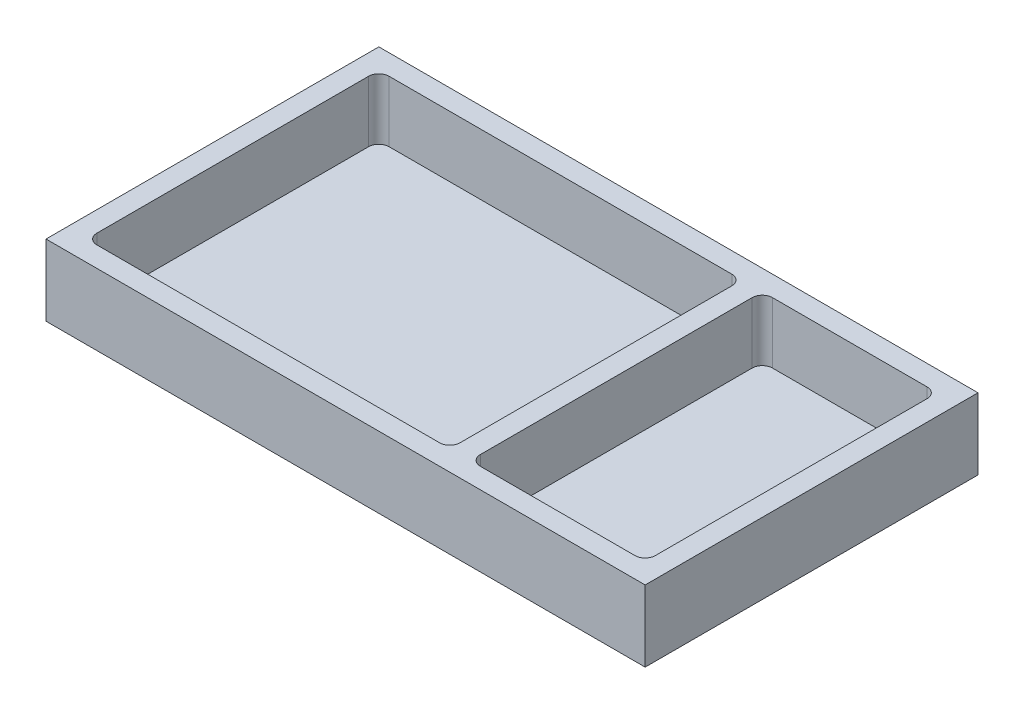
ISO-10303-21;
HEADER;
FILE_DESCRIPTION(('STEP AP214'),'2;1');
FILE_NAME('part.step','',(''),(''),'','','');
FILE_SCHEMA(('AUTOMOTIVE_DESIGN { 1 0 10303 214 1 1 1 1 }'));
ENDSEC;
DATA;
#1=APPLICATION_CONTEXT('core data for automotive mechanical design processes');
#2=APPLICATION_PROTOCOL_DEFINITION('international standard','automotive_design',2000,#1);
#3=PRODUCT_CONTEXT('',#1,'mechanical');
#4=PRODUCT('Part','Part','',(#3));
#5=PRODUCT_RELATED_PRODUCT_CATEGORY('part','',(#4));
#6=PRODUCT_DEFINITION_FORMATION('','',#4);
#7=PRODUCT_DEFINITION_CONTEXT('part definition',#1,'design');
#8=PRODUCT_DEFINITION('design','',#6,#7);
#9=PRODUCT_DEFINITION_SHAPE('','',#8);
#10=(LENGTH_UNIT() NAMED_UNIT(*) SI_UNIT(.MILLI.,.METRE.));
#11=(NAMED_UNIT(*) PLANE_ANGLE_UNIT() SI_UNIT($,.RADIAN.));
#12=(NAMED_UNIT(*) SI_UNIT($,.STERADIAN.) SOLID_ANGLE_UNIT());
#13=UNCERTAINTY_MEASURE_WITH_UNIT(LENGTH_MEASURE(1.E-05),#10,'distance_accuracy_value','');
#14=(GEOMETRIC_REPRESENTATION_CONTEXT(3) GLOBAL_UNCERTAINTY_ASSIGNED_CONTEXT((#13)) GLOBAL_UNIT_ASSIGNED_CONTEXT((#10,
#11,#12)) REPRESENTATION_CONTEXT('',''));
#15=CARTESIAN_POINT('',(0.,0.,0.));
#16=DIRECTION('',(0.,0.,1.));
#17=DIRECTION('',(1.,0.,0.));
#18=AXIS2_PLACEMENT_3D('',#15,#16,#17);
#19=CARTESIAN_POINT('',(0.,19.05,-103.910500649562));
#20=DIRECTION('',(0.,-1.,0.));
#21=DIRECTION('',(0.,0.,-1.));
#22=AXIS2_PLACEMENT_3D('',#19,#20,#21);
#23=PLANE('',#22);
#24=CARTESIAN_POINT('',(116.541319733707,19.05,-94.3855006495616));
#25=DIRECTION('',(0.,1.,0.));
#26=DIRECTION('',(0.,0.,1.));
#27=AXIS2_PLACEMENT_3D('',#24,#25,#26);
#28=CIRCLE('',#27,3.175);
#29=CARTESIAN_POINT('',(119.716319733707,19.05,-94.3855006495616));
#30=VERTEX_POINT('',#29);
#31=CARTESIAN_POINT('',(116.541319733707,19.05,-97.5605006495616));
#32=VERTEX_POINT('',#31);
#33=EDGE_CURVE('E250',#30,#32,#28,.T.);
#34=ORIENTED_EDGE('',*,*,#33,.F.);
#35=DIRECTION('',(0.,0.,-1.));
#36=VECTOR('',#35,1.);
#37=CARTESIAN_POINT('',(119.716319733707,19.05,-94.3855006495616));
#38=LINE('',#37,#36);
#39=CARTESIAN_POINT('',(119.716319733707,19.05,-9.52500000000002));
#40=VERTEX_POINT('',#39);
#41=EDGE_CURVE('E265',#40,#30,#38,.T.);
#42=ORIENTED_EDGE('',*,*,#41,.F.);
#43=CARTESIAN_POINT('',(116.541319733707,19.05,-9.525));
#44=DIRECTION('',(0.,1.,0.));
#45=DIRECTION('',(0.,0.,-1.));
#46=AXIS2_PLACEMENT_3D('',#43,#44,#45);
#47=CIRCLE('',#46,3.175);
#48=CARTESIAN_POINT('',(116.541319733707,19.05,-6.35));
#49=VERTEX_POINT('',#48);
#50=EDGE_CURVE('E263',#49,#40,#47,.T.);
#51=ORIENTED_EDGE('',*,*,#50,.F.);
#52=DIRECTION('',(1.,0.,0.));
#53=VECTOR('',#52,1.);
#54=CARTESIAN_POINT('',(9.52500000000002,19.05,-6.35));
#55=LINE('',#54,#53);
#56=CARTESIAN_POINT('',(9.52500000000002,19.05,-6.35));
#57=VERTEX_POINT('',#56);
#58=EDGE_CURVE('E261',#57,#49,#55,.T.);
#59=ORIENTED_EDGE('',*,*,#58,.F.);
#60=CARTESIAN_POINT('',(9.525,19.05,-9.525));
#61=DIRECTION('',(0.,1.,0.));
#62=DIRECTION('',(0.,0.,-1.));
#63=AXIS2_PLACEMENT_3D('',#60,#61,#62);
#64=CIRCLE('',#63,3.175);
#65=CARTESIAN_POINT('',(6.35,19.05,-9.52500000000002));
#66=VERTEX_POINT('',#65);
#67=EDGE_CURVE('E259',#66,#57,#64,.T.);
#68=ORIENTED_EDGE('',*,*,#67,.F.);
#69=DIRECTION('',(0.,0.,1.));
#70=VECTOR('',#69,1.);
#71=CARTESIAN_POINT('',(6.35,19.05,-9.52500000000002));
#72=LINE('',#71,#70);
#73=CARTESIAN_POINT('',(6.35,19.05,-94.3855006495616));
#74=VERTEX_POINT('',#73);
#75=EDGE_CURVE('E257',#74,#66,#72,.T.);
#76=ORIENTED_EDGE('',*,*,#75,.F.);
#77=CARTESIAN_POINT('',(9.525,19.05,-94.3855006495616));
#78=DIRECTION('',(0.,1.,0.));
#79=DIRECTION('',(0.,0.,-1.));
#80=AXIS2_PLACEMENT_3D('',#77,#78,#79);
#81=CIRCLE('',#80,3.175);
#82=CARTESIAN_POINT('',(9.52500000000003,19.05,-97.5605006495616));
#83=VERTEX_POINT('',#82);
#84=EDGE_CURVE('E255',#83,#74,#81,.T.);
#85=ORIENTED_EDGE('',*,*,#84,.F.);
#86=DIRECTION('',(-1.,0.,0.));
#87=VECTOR('',#86,1.);
#88=CARTESIAN_POINT('',(9.52500000000002,19.05,-97.5605006495616));
#89=LINE('',#88,#87);
#90=EDGE_CURVE('E252',#32,#83,#89,.T.);
#91=ORIENTED_EDGE('',*,*,#90,.F.);
#92=EDGE_LOOP('',(#34,#42,#51,#59,#68,#76,#85,#91));
#93=FACE_BOUND('',#92,.T.);
#94=DIRECTION('',(0.,0.,1.));
#95=VECTOR('',#94,1.);
#96=CARTESIAN_POINT('',(0.,19.05,0.));
#97=LINE('',#96,#95);
#98=CARTESIAN_POINT('',(0.,19.05,-103.910500649562));
#99=VERTEX_POINT('',#98);
#100=CARTESIAN_POINT('',(0.,19.05,0.));
#101=VERTEX_POINT('',#100);
#102=EDGE_CURVE('E305',#99,#101,#97,.T.);
#103=ORIENTED_EDGE('',*,*,#102,.T.);
#104=DIRECTION('',(1.,0.,0.));
#105=VECTOR('',#104,1.);
#106=CARTESIAN_POINT('',(0.,19.05,0.));
#107=LINE('',#106,#105);
#108=CARTESIAN_POINT('',(187.051787580175,19.05,0.));
#109=VERTEX_POINT('',#108);
#110=EDGE_CURVE('E171',#101,#109,#107,.T.);
#111=ORIENTED_EDGE('',*,*,#110,.T.);
#112=DIRECTION('',(0.,0.,-1.));
#113=VECTOR('',#112,1.);
#114=CARTESIAN_POINT('',(187.051787580175,19.05,0.));
#115=LINE('',#114,#113);
#116=CARTESIAN_POINT('',(187.051787580175,19.05,-103.910500649562));
#117=VERTEX_POINT('',#116);
#118=EDGE_CURVE('E308',#109,#117,#115,.T.);
#119=ORIENTED_EDGE('',*,*,#118,.T.);
#120=DIRECTION('',(-1.,0.,0.));
#121=VECTOR('',#120,1.);
#122=CARTESIAN_POINT('',(0.,19.05,-103.910500649562));
#123=LINE('',#122,#121);
#124=EDGE_CURVE('E310',#117,#99,#123,.T.);
#125=ORIENTED_EDGE('',*,*,#124,.T.);
#126=EDGE_LOOP('',(#103,#111,#119,#125));
#127=FACE_BOUND('',#126,.T.);
#128=CARTESIAN_POINT('',(129.241319733707,19.05,-94.3855006495616));
#129=DIRECTION('',(0.,1.,0.));
#130=DIRECTION('',(0.,0.,1.));
#131=AXIS2_PLACEMENT_3D('',#128,#129,#130);
#132=CIRCLE('',#131,3.175);
#133=CARTESIAN_POINT('',(129.241319733707,19.05,-97.5605006495616));
#134=VERTEX_POINT('',#133);
#135=CARTESIAN_POINT('',(126.066319733707,19.05,-94.3855006495616));
#136=VERTEX_POINT('',#135);
#137=EDGE_CURVE('E194',#134,#136,#132,.T.);
#138=ORIENTED_EDGE('',*,*,#137,.F.);
#139=DIRECTION('',(-1.,0.,0.));
#140=VECTOR('',#139,1.);
#141=CARTESIAN_POINT('',(129.241319733707,19.05,-97.5605006495616));
#142=LINE('',#141,#140);
#143=CARTESIAN_POINT('',(177.526787580175,19.05,-97.5605006495616));
#144=VERTEX_POINT('',#143);
#145=EDGE_CURVE('E209',#144,#134,#142,.T.);
#146=ORIENTED_EDGE('',*,*,#145,.F.);
#147=CARTESIAN_POINT('',(177.526787580175,19.05,-94.3855006495616));
#148=DIRECTION('',(0.,1.,0.));
#149=DIRECTION('',(0.,0.,1.));
#150=AXIS2_PLACEMENT_3D('',#147,#148,#149);
#151=CIRCLE('',#150,3.175);
#152=CARTESIAN_POINT('',(180.701787580175,19.05,-94.3855006495616));
#153=VERTEX_POINT('',#152);
#154=EDGE_CURVE('E207',#153,#144,#151,.T.);
#155=ORIENTED_EDGE('',*,*,#154,.F.);
#156=DIRECTION('',(0.,0.,-1.));
#157=VECTOR('',#156,1.);
#158=CARTESIAN_POINT('',(180.701787580175,19.05,-9.52500000000002));
#159=LINE('',#158,#157);
#160=CARTESIAN_POINT('',(180.701787580175,19.05,-9.52500000000002));
#161=VERTEX_POINT('',#160);
#162=EDGE_CURVE('E205',#161,#153,#159,.T.);
#163=ORIENTED_EDGE('',*,*,#162,.F.);
#164=CARTESIAN_POINT('',(177.526787580175,19.05,-9.525));
#165=DIRECTION('',(0.,1.,0.));
#166=DIRECTION('',(0.,0.,-1.));
#167=AXIS2_PLACEMENT_3D('',#164,#165,#166);
#168=CIRCLE('',#167,3.17500000000001);
#169=CARTESIAN_POINT('',(177.526787580175,19.05,-6.34999999999999));
#170=VERTEX_POINT('',#169);
#171=EDGE_CURVE('E203',#170,#161,#168,.T.);
#172=ORIENTED_EDGE('',*,*,#171,.F.);
#173=DIRECTION('',(1.,0.,0.));
#174=VECTOR('',#173,1.);
#175=CARTESIAN_POINT('',(129.241319733707,19.05,-6.34999999999999));
#176=LINE('',#175,#174);
#177=CARTESIAN_POINT('',(129.241319733707,19.05,-6.34999999999999));
#178=VERTEX_POINT('',#177);
#179=EDGE_CURVE('E201',#178,#170,#176,.T.);
#180=ORIENTED_EDGE('',*,*,#179,.F.);
#181=CARTESIAN_POINT('',(129.241319733707,19.05,-9.525));
#182=DIRECTION('',(0.,1.,0.));
#183=DIRECTION('',(0.,0.,1.));
#184=AXIS2_PLACEMENT_3D('',#181,#182,#183);
#185=CIRCLE('',#184,3.17500000000001);
#186=CARTESIAN_POINT('',(126.066319733707,19.05,-9.52500000000002));
#187=VERTEX_POINT('',#186);
#188=EDGE_CURVE('E199',#187,#178,#185,.T.);
#189=ORIENTED_EDGE('',*,*,#188,.F.);
#190=DIRECTION('',(0.,0.,1.));
#191=VECTOR('',#190,1.);
#192=CARTESIAN_POINT('',(126.066319733707,19.05,-94.3855006495616));
#193=LINE('',#192,#191);
#194=EDGE_CURVE('E196',#136,#187,#193,.T.);
#195=ORIENTED_EDGE('',*,*,#194,.F.);
#196=EDGE_LOOP('',(#138,#146,#155,#163,#172,#180,#189,#195));
#197=FACE_BOUND('',#196,.T.);
#198=ADVANCED_FACE('F31',(#93,#127,#197),#23,.F.);
#199=CARTESIAN_POINT('',(0.,19.05,0.));
#200=DIRECTION('',(1.,0.,0.));
#201=DIRECTION('',(0.,0.,-1.));
#202=AXIS2_PLACEMENT_3D('',#199,#200,#201);
#203=PLANE('',#202);
#204=DIRECTION('',(0.,-1.,0.));
#205=VECTOR('',#204,1.);
#206=CARTESIAN_POINT('',(0.,19.05,-103.910500649562));
#207=LINE('',#206,#205);
#208=CARTESIAN_POINT('',(0.,-3.175,-103.910500649562));
#209=VERTEX_POINT('',#208);
#210=EDGE_CURVE('E187',#99,#209,#207,.T.);
#211=ORIENTED_EDGE('',*,*,#210,.T.);
#212=DIRECTION('',(0.,0.,1.));
#213=VECTOR('',#212,1.);
#214=CARTESIAN_POINT('',(0.,-3.175,-103.910500649562));
#215=LINE('',#214,#213);
#216=CARTESIAN_POINT('',(0.,-3.175,0.));
#217=VERTEX_POINT('',#216);
#218=EDGE_CURVE('E181',#209,#217,#215,.T.);
#219=ORIENTED_EDGE('',*,*,#218,.T.);
#220=DIRECTION('',(0.,-1.,0.));
#221=VECTOR('',#220,1.);
#222=CARTESIAN_POINT('',(0.,19.05,0.));
#223=LINE('',#222,#221);
#224=EDGE_CURVE('E11',#101,#217,#223,.T.);
#225=ORIENTED_EDGE('',*,*,#224,.F.);
#226=ORIENTED_EDGE('',*,*,#102,.F.);
#227=EDGE_LOOP('',(#211,#219,#225,#226));
#228=FACE_BOUND('',#227,.T.);
#229=ADVANCED_FACE('F33',(#228),#203,.F.);
#230=CARTESIAN_POINT('',(0.,19.05,0.));
#231=DIRECTION('',(0.,0.,-1.));
#232=DIRECTION('',(-1.,0.,0.));
#233=AXIS2_PLACEMENT_3D('',#230,#231,#232);
#234=PLANE('',#233);
#235=ORIENTED_EDGE('',*,*,#224,.T.);
#236=DIRECTION('',(1.,0.,0.));
#237=VECTOR('',#236,1.);
#238=CARTESIAN_POINT('',(0.,-3.175,0.));
#239=LINE('',#238,#237);
#240=CARTESIAN_POINT('',(187.051787580175,-3.175,0.));
#241=VERTEX_POINT('',#240);
#242=EDGE_CURVE('E170',#217,#241,#239,.T.);
#243=ORIENTED_EDGE('',*,*,#242,.T.);
#244=DIRECTION('',(0.,-1.,0.));
#245=VECTOR('',#244,1.);
#246=CARTESIAN_POINT('',(187.051787580175,19.05,0.));
#247=LINE('',#246,#245);
#248=EDGE_CURVE('E39',#109,#241,#247,.T.);
#249=ORIENTED_EDGE('',*,*,#248,.F.);
#250=ORIENTED_EDGE('',*,*,#110,.F.);
#251=EDGE_LOOP('',(#235,#243,#249,#250));
#252=FACE_BOUND('',#251,.T.);
#253=ADVANCED_FACE('F168',(#252),#234,.F.);
#254=CARTESIAN_POINT('',(187.051787580175,19.05,0.));
#255=DIRECTION('',(-1.,0.,0.));
#256=DIRECTION('',(0.,0.,1.));
#257=AXIS2_PLACEMENT_3D('',#254,#255,#256);
#258=PLANE('',#257);
#259=ORIENTED_EDGE('',*,*,#248,.T.);
#260=DIRECTION('',(0.,0.,-1.));
#261=VECTOR('',#260,1.);
#262=CARTESIAN_POINT('',(187.051787580175,-3.175,-103.910500649562));
#263=LINE('',#262,#261);
#264=CARTESIAN_POINT('',(187.051787580175,-3.175,-103.910500649562));
#265=VERTEX_POINT('',#264);
#266=EDGE_CURVE('E184',#241,#265,#263,.T.);
#267=ORIENTED_EDGE('',*,*,#266,.T.);
#268=DIRECTION('',(0.,-1.,0.));
#269=VECTOR('',#268,1.);
#270=CARTESIAN_POINT('',(187.051787580175,19.05,-103.910500649562));
#271=LINE('',#270,#269);
#272=EDGE_CURVE('E313',#117,#265,#271,.T.);
#273=ORIENTED_EDGE('',*,*,#272,.F.);
#274=ORIENTED_EDGE('',*,*,#118,.F.);
#275=EDGE_LOOP('',(#259,#267,#273,#274));
#276=FACE_BOUND('',#275,.T.);
#277=ADVANCED_FACE('F316',(#276),#258,.F.);
#278=CARTESIAN_POINT('',(0.,19.05,-103.910500649562));
#279=DIRECTION('',(0.,0.,1.));
#280=DIRECTION('',(1.,0.,0.));
#281=AXIS2_PLACEMENT_3D('',#278,#279,#280);
#282=PLANE('',#281);
#283=ORIENTED_EDGE('',*,*,#272,.T.);
#284=DIRECTION('',(-1.,0.,0.));
#285=VECTOR('',#284,1.);
#286=CARTESIAN_POINT('',(0.,-3.175,-103.910500649562));
#287=LINE('',#286,#285);
#288=EDGE_CURVE('E191',#265,#209,#287,.T.);
#289=ORIENTED_EDGE('',*,*,#288,.T.);
#290=ORIENTED_EDGE('',*,*,#210,.F.);
#291=ORIENTED_EDGE('',*,*,#124,.F.);
#292=EDGE_LOOP('',(#283,#289,#290,#291));
#293=FACE_BOUND('',#292,.T.);
#294=ADVANCED_FACE('F322',(#293),#282,.F.);
#295=CARTESIAN_POINT('',(116.541319733707,19.05,-94.3855006495616));
#296=DIRECTION('',(0.,-1.,0.));
#297=DIRECTION('',(0.,0.,-1.));
#298=AXIS2_PLACEMENT_3D('',#295,#296,#297);
#299=CYLINDRICAL_SURFACE('',#298,3.175);
#300=CARTESIAN_POINT('',(116.541319733707,0.,-94.3855006495616));
#301=DIRECTION('',(0.,1.,0.));
#302=DIRECTION('',(0.,0.,1.));
#303=AXIS2_PLACEMENT_3D('',#300,#301,#302);
#304=CIRCLE('',#303,3.175);
#305=CARTESIAN_POINT('',(119.716319733707,0.,-94.3855006495616));
#306=VERTEX_POINT('',#305);
#307=CARTESIAN_POINT('',(116.541319733707,0.,-97.5605006495616));
#308=VERTEX_POINT('',#307);
#309=EDGE_CURVE('E249',#306,#308,#304,.T.);
#310=ORIENTED_EDGE('',*,*,#309,.F.);
#311=DIRECTION('',(0.,-1.,0.));
#312=VECTOR('',#311,1.);
#313=CARTESIAN_POINT('',(119.716319733707,19.05,-94.3855006495616));
#314=LINE('',#313,#312);
#315=EDGE_CURVE('E267',#30,#306,#314,.T.);
#316=ORIENTED_EDGE('',*,*,#315,.F.);
#317=ORIENTED_EDGE('',*,*,#33,.T.);
#318=DIRECTION('',(0.,-1.,0.));
#319=VECTOR('',#318,1.);
#320=CARTESIAN_POINT('',(116.541319733707,19.05,-97.5605006495616));
#321=LINE('',#320,#319);
#322=EDGE_CURVE('E302',#32,#308,#321,.T.);
#323=ORIENTED_EDGE('',*,*,#322,.T.);
#324=EDGE_LOOP('',(#310,#316,#317,#323));
#325=FACE_BOUND('',#324,.T.);
#326=ADVANCED_FACE('F324',(#325),#299,.F.);
#327=CARTESIAN_POINT('',(9.52500000000002,19.05,-97.5605006495616));
#328=DIRECTION('',(0.,0.,1.));
#329=DIRECTION('',(1.,0.,0.));
#330=AXIS2_PLACEMENT_3D('',#327,#328,#329);
#331=PLANE('',#330);
#332=DIRECTION('',(-1.,0.,0.));
#333=VECTOR('',#332,1.);
#334=CARTESIAN_POINT('',(9.52500000000002,0.,-97.5605006495616));
#335=LINE('',#334,#333);
#336=CARTESIAN_POINT('',(9.52500000000003,0.,-97.5605006495616));
#337=VERTEX_POINT('',#336);
#338=EDGE_CURVE('E270',#308,#337,#335,.T.);
#339=ORIENTED_EDGE('',*,*,#338,.F.);
#340=ORIENTED_EDGE('',*,*,#322,.F.);
#341=ORIENTED_EDGE('',*,*,#90,.T.);
#342=DIRECTION('',(0.,-1.,0.));
#343=VECTOR('',#342,1.);
#344=CARTESIAN_POINT('',(9.52500000000003,19.05,-97.5605006495616));
#345=LINE('',#344,#343);
#346=EDGE_CURVE('E300',#83,#337,#345,.T.);
#347=ORIENTED_EDGE('',*,*,#346,.T.);
#348=EDGE_LOOP('',(#339,#340,#341,#347));
#349=FACE_BOUND('',#348,.T.);
#350=ADVANCED_FACE('F330',(#349),#331,.T.);
#351=CARTESIAN_POINT('',(9.525,19.05,-94.3855006495616));
#352=DIRECTION('',(0.,-1.,0.));
#353=DIRECTION('',(0.,0.,-1.));
#354=AXIS2_PLACEMENT_3D('',#351,#352,#353);
#355=CYLINDRICAL_SURFACE('',#354,3.175);
#356=CARTESIAN_POINT('',(9.525,0.,-94.3855006495616));
#357=DIRECTION('',(0.,1.,0.));
#358=DIRECTION('',(0.,0.,-1.));
#359=AXIS2_PLACEMENT_3D('',#356,#357,#358);
#360=CIRCLE('',#359,3.175);
#361=CARTESIAN_POINT('',(6.35,0.,-94.3855006495616));
#362=VERTEX_POINT('',#361);
#363=EDGE_CURVE('E273',#337,#362,#360,.T.);
#364=ORIENTED_EDGE('',*,*,#363,.F.);
#365=ORIENTED_EDGE('',*,*,#346,.F.);
#366=ORIENTED_EDGE('',*,*,#84,.T.);
#367=DIRECTION('',(0.,-1.,0.));
#368=VECTOR('',#367,1.);
#369=CARTESIAN_POINT('',(6.35,19.05,-94.3855006495616));
#370=LINE('',#369,#368);
#371=EDGE_CURVE('E298',#74,#362,#370,.T.);
#372=ORIENTED_EDGE('',*,*,#371,.T.);
#373=EDGE_LOOP('',(#364,#365,#366,#372));
#374=FACE_BOUND('',#373,.T.);
#375=ADVANCED_FACE('F344',(#374),#355,.F.);
#376=CARTESIAN_POINT('',(6.35,19.05,-9.52500000000002));
#377=DIRECTION('',(1.,0.,0.));
#378=DIRECTION('',(0.,0.,-1.));
#379=AXIS2_PLACEMENT_3D('',#376,#377,#378);
#380=PLANE('',#379);
#381=DIRECTION('',(0.,0.,1.));
#382=VECTOR('',#381,1.);
#383=CARTESIAN_POINT('',(6.35,0.,-9.52500000000002));
#384=LINE('',#383,#382);
#385=CARTESIAN_POINT('',(6.35,0.,-9.52500000000002));
#386=VERTEX_POINT('',#385);
#387=EDGE_CURVE('E276',#362,#386,#384,.T.);
#388=ORIENTED_EDGE('',*,*,#387,.F.);
#389=ORIENTED_EDGE('',*,*,#371,.F.);
#390=ORIENTED_EDGE('',*,*,#75,.T.);
#391=DIRECTION('',(0.,-1.,0.));
#392=VECTOR('',#391,1.);
#393=CARTESIAN_POINT('',(6.35,19.05,-9.52500000000002));
#394=LINE('',#393,#392);
#395=EDGE_CURVE('E296',#66,#386,#394,.T.);
#396=ORIENTED_EDGE('',*,*,#395,.T.);
#397=EDGE_LOOP('',(#388,#389,#390,#396));
#398=FACE_BOUND('',#397,.T.);
#399=ADVANCED_FACE('F348',(#398),#380,.T.);
#400=CARTESIAN_POINT('',(9.525,19.05,-9.525));
#401=DIRECTION('',(0.,-1.,0.));
#402=DIRECTION('',(0.,0.,-1.));
#403=AXIS2_PLACEMENT_3D('',#400,#401,#402);
#404=CYLINDRICAL_SURFACE('',#403,3.175);
#405=CARTESIAN_POINT('',(9.525,0.,-9.525));
#406=DIRECTION('',(0.,1.,0.));
#407=DIRECTION('',(0.,0.,-1.));
#408=AXIS2_PLACEMENT_3D('',#405,#406,#407);
#409=CIRCLE('',#408,3.175);
#410=CARTESIAN_POINT('',(9.52500000000002,0.,-6.35));
#411=VERTEX_POINT('',#410);
#412=EDGE_CURVE('E279',#386,#411,#409,.T.);
#413=ORIENTED_EDGE('',*,*,#412,.F.);
#414=ORIENTED_EDGE('',*,*,#395,.F.);
#415=ORIENTED_EDGE('',*,*,#67,.T.);
#416=DIRECTION('',(0.,-1.,0.));
#417=VECTOR('',#416,1.);
#418=CARTESIAN_POINT('',(9.52500000000002,19.05,-6.35));
#419=LINE('',#418,#417);
#420=EDGE_CURVE('E294',#57,#411,#419,.T.);
#421=ORIENTED_EDGE('',*,*,#420,.T.);
#422=EDGE_LOOP('',(#413,#414,#415,#421));
#423=FACE_BOUND('',#422,.T.);
#424=ADVANCED_FACE('F352',(#423),#404,.F.);
#425=CARTESIAN_POINT('',(9.52500000000002,19.05,-6.35));
#426=DIRECTION('',(0.,0.,-1.));
#427=DIRECTION('',(-1.,0.,0.));
#428=AXIS2_PLACEMENT_3D('',#425,#426,#427);
#429=PLANE('',#428);
#430=DIRECTION('',(1.,0.,0.));
#431=VECTOR('',#430,1.);
#432=CARTESIAN_POINT('',(9.52500000000002,0.,-6.35));
#433=LINE('',#432,#431);
#434=CARTESIAN_POINT('',(116.541319733707,0.,-6.35));
#435=VERTEX_POINT('',#434);
#436=EDGE_CURVE('E282',#411,#435,#433,.T.);
#437=ORIENTED_EDGE('',*,*,#436,.F.);
#438=ORIENTED_EDGE('',*,*,#420,.F.);
#439=ORIENTED_EDGE('',*,*,#58,.T.);
#440=DIRECTION('',(0.,-1.,0.));
#441=VECTOR('',#440,1.);
#442=CARTESIAN_POINT('',(116.541319733707,19.05,-6.35));
#443=LINE('',#442,#441);
#444=EDGE_CURVE('E292',#49,#435,#443,.T.);
#445=ORIENTED_EDGE('',*,*,#444,.T.);
#446=EDGE_LOOP('',(#437,#438,#439,#445));
#447=FACE_BOUND('',#446,.T.);
#448=ADVANCED_FACE('F356',(#447),#429,.T.);
#449=CARTESIAN_POINT('',(116.541319733707,19.05,-9.525));
#450=DIRECTION('',(0.,-1.,0.));
#451=DIRECTION('',(0.,0.,-1.));
#452=AXIS2_PLACEMENT_3D('',#449,#450,#451);
#453=CYLINDRICAL_SURFACE('',#452,3.175);
#454=CARTESIAN_POINT('',(116.541319733707,0.,-9.525));
#455=DIRECTION('',(0.,1.,0.));
#456=DIRECTION('',(0.,0.,-1.));
#457=AXIS2_PLACEMENT_3D('',#454,#455,#456);
#458=CIRCLE('',#457,3.175);
#459=CARTESIAN_POINT('',(119.716319733707,0.,-9.52500000000002));
#460=VERTEX_POINT('',#459);
#461=EDGE_CURVE('E285',#435,#460,#458,.T.);
#462=ORIENTED_EDGE('',*,*,#461,.F.);
#463=ORIENTED_EDGE('',*,*,#444,.F.);
#464=ORIENTED_EDGE('',*,*,#50,.T.);
#465=DIRECTION('',(0.,-1.,0.));
#466=VECTOR('',#465,1.);
#467=CARTESIAN_POINT('',(119.716319733707,19.05,-9.52500000000002));
#468=LINE('',#467,#466);
#469=EDGE_CURVE('E54',#40,#460,#468,.T.);
#470=ORIENTED_EDGE('',*,*,#469,.T.);
#471=EDGE_LOOP('',(#462,#463,#464,#470));
#472=FACE_BOUND('',#471,.T.);
#473=ADVANCED_FACE('F360',(#472),#453,.F.);
#474=CARTESIAN_POINT('',(119.716319733707,19.05,-94.3855006495616));
#475=DIRECTION('',(-1.,0.,0.));
#476=DIRECTION('',(0.,0.,1.));
#477=AXIS2_PLACEMENT_3D('',#474,#475,#476);
#478=PLANE('',#477);
#479=DIRECTION('',(0.,0.,-1.));
#480=VECTOR('',#479,1.);
#481=CARTESIAN_POINT('',(119.716319733707,0.,-94.3855006495616));
#482=LINE('',#481,#480);
#483=EDGE_CURVE('E253',#460,#306,#482,.T.);
#484=ORIENTED_EDGE('',*,*,#483,.F.);
#485=ORIENTED_EDGE('',*,*,#469,.F.);
#486=ORIENTED_EDGE('',*,*,#41,.T.);
#487=ORIENTED_EDGE('',*,*,#315,.T.);
#488=EDGE_LOOP('',(#484,#485,#486,#487));
#489=FACE_BOUND('',#488,.T.);
#490=ADVANCED_FACE('F364',(#489),#478,.T.);
#491=CARTESIAN_POINT('',(129.241319733707,19.05,-94.3855006495616));
#492=DIRECTION('',(0.,-1.,0.));
#493=DIRECTION('',(0.,0.,-1.));
#494=AXIS2_PLACEMENT_3D('',#491,#492,#493);
#495=CYLINDRICAL_SURFACE('',#494,3.175);
#496=CARTESIAN_POINT('',(129.241319733707,0.,-94.3855006495616));
#497=DIRECTION('',(0.,1.,0.));
#498=DIRECTION('',(0.,0.,1.));
#499=AXIS2_PLACEMENT_3D('',#496,#497,#498);
#500=CIRCLE('',#499,3.175);
#501=CARTESIAN_POINT('',(129.241319733707,0.,-97.5605006495616));
#502=VERTEX_POINT('',#501);
#503=CARTESIAN_POINT('',(126.066319733707,0.,-94.3855006495616));
#504=VERTEX_POINT('',#503);
#505=EDGE_CURVE('E193',#502,#504,#500,.T.);
#506=ORIENTED_EDGE('',*,*,#505,.F.);
#507=DIRECTION('',(0.,-1.,0.));
#508=VECTOR('',#507,1.);
#509=CARTESIAN_POINT('',(129.241319733707,19.05,-97.5605006495616));
#510=LINE('',#509,#508);
#511=EDGE_CURVE('E211',#134,#502,#510,.T.);
#512=ORIENTED_EDGE('',*,*,#511,.F.);
#513=ORIENTED_EDGE('',*,*,#137,.T.);
#514=DIRECTION('',(0.,-1.,0.));
#515=VECTOR('',#514,1.);
#516=CARTESIAN_POINT('',(126.066319733707,19.05,-94.3855006495616));
#517=LINE('',#516,#515);
#518=EDGE_CURVE('E246',#136,#504,#517,.T.);
#519=ORIENTED_EDGE('',*,*,#518,.T.);
#520=EDGE_LOOP('',(#506,#512,#513,#519));
#521=FACE_BOUND('',#520,.T.);
#522=ADVANCED_FACE('F368',(#521),#495,.F.);
#523=CARTESIAN_POINT('',(126.066319733707,19.05,-94.3855006495616));
#524=DIRECTION('',(1.,0.,0.));
#525=DIRECTION('',(0.,0.,-1.));
#526=AXIS2_PLACEMENT_3D('',#523,#524,#525);
#527=PLANE('',#526);
#528=DIRECTION('',(0.,0.,1.));
#529=VECTOR('',#528,1.);
#530=CARTESIAN_POINT('',(126.066319733707,0.,-94.3855006495616));
#531=LINE('',#530,#529);
#532=CARTESIAN_POINT('',(126.066319733707,0.,-9.52500000000002));
#533=VERTEX_POINT('',#532);
#534=EDGE_CURVE('E214',#504,#533,#531,.T.);
#535=ORIENTED_EDGE('',*,*,#534,.F.);
#536=ORIENTED_EDGE('',*,*,#518,.F.);
#537=ORIENTED_EDGE('',*,*,#194,.T.);
#538=DIRECTION('',(0.,-1.,0.));
#539=VECTOR('',#538,1.);
#540=CARTESIAN_POINT('',(126.066319733707,19.05,-9.52500000000002));
#541=LINE('',#540,#539);
#542=EDGE_CURVE('E244',#187,#533,#541,.T.);
#543=ORIENTED_EDGE('',*,*,#542,.T.);
#544=EDGE_LOOP('',(#535,#536,#537,#543));
#545=FACE_BOUND('',#544,.T.);
#546=ADVANCED_FACE('F371',(#545),#527,.T.);
#547=CARTESIAN_POINT('',(129.241319733707,19.05,-9.525));
#548=DIRECTION('',(0.,-1.,0.));
#549=DIRECTION('',(0.,0.,-1.));
#550=AXIS2_PLACEMENT_3D('',#547,#548,#549);
#551=CYLINDRICAL_SURFACE('',#550,3.17500000000001);
#552=CARTESIAN_POINT('',(129.241319733707,0.,-9.525));
#553=DIRECTION('',(0.,1.,0.));
#554=DIRECTION('',(0.,0.,1.));
#555=AXIS2_PLACEMENT_3D('',#552,#553,#554);
#556=CIRCLE('',#555,3.17500000000001);
#557=CARTESIAN_POINT('',(129.241319733707,0.,-6.34999999999999));
#558=VERTEX_POINT('',#557);
#559=EDGE_CURVE('E217',#533,#558,#556,.T.);
#560=ORIENTED_EDGE('',*,*,#559,.F.);
#561=ORIENTED_EDGE('',*,*,#542,.F.);
#562=ORIENTED_EDGE('',*,*,#188,.T.);
#563=DIRECTION('',(0.,-1.,0.));
#564=VECTOR('',#563,1.);
#565=CARTESIAN_POINT('',(129.241319733707,19.05,-6.34999999999999));
#566=LINE('',#565,#564);
#567=EDGE_CURVE('E242',#178,#558,#566,.T.);
#568=ORIENTED_EDGE('',*,*,#567,.T.);
#569=EDGE_LOOP('',(#560,#561,#562,#568));
#570=FACE_BOUND('',#569,.T.);
#571=ADVANCED_FACE('F375',(#570),#551,.F.);
#572=CARTESIAN_POINT('',(129.241319733707,19.05,-6.34999999999999));
#573=DIRECTION('',(0.,0.,-1.));
#574=DIRECTION('',(-1.,0.,0.));
#575=AXIS2_PLACEMENT_3D('',#572,#573,#574);
#576=PLANE('',#575);
#577=DIRECTION('',(1.,0.,0.));
#578=VECTOR('',#577,1.);
#579=CARTESIAN_POINT('',(129.241319733707,0.,-6.34999999999999));
#580=LINE('',#579,#578);
#581=CARTESIAN_POINT('',(177.526787580175,0.,-6.34999999999999));
#582=VERTEX_POINT('',#581);
#583=EDGE_CURVE('E220',#558,#582,#580,.T.);
#584=ORIENTED_EDGE('',*,*,#583,.F.);
#585=ORIENTED_EDGE('',*,*,#567,.F.);
#586=ORIENTED_EDGE('',*,*,#179,.T.);
#587=DIRECTION('',(0.,-1.,0.));
#588=VECTOR('',#587,1.);
#589=CARTESIAN_POINT('',(177.526787580175,19.05,-6.34999999999999));
#590=LINE('',#589,#588);
#591=EDGE_CURVE('E240',#170,#582,#590,.T.);
#592=ORIENTED_EDGE('',*,*,#591,.T.);
#593=EDGE_LOOP('',(#584,#585,#586,#592));
#594=FACE_BOUND('',#593,.T.);
#595=ADVANCED_FACE('F379',(#594),#576,.T.);
#596=CARTESIAN_POINT('',(177.526787580175,19.05,-9.525));
#597=DIRECTION('',(0.,-1.,0.));
#598=DIRECTION('',(0.,0.,-1.));
#599=AXIS2_PLACEMENT_3D('',#596,#597,#598);
#600=CYLINDRICAL_SURFACE('',#599,3.17500000000001);
#601=CARTESIAN_POINT('',(177.526787580175,0.,-9.525));
#602=DIRECTION('',(0.,1.,0.));
#603=DIRECTION('',(0.,0.,-1.));
#604=AXIS2_PLACEMENT_3D('',#601,#602,#603);
#605=CIRCLE('',#604,3.17500000000001);
#606=CARTESIAN_POINT('',(180.701787580175,0.,-9.52500000000002));
#607=VERTEX_POINT('',#606);
#608=EDGE_CURVE('E223',#582,#607,#605,.T.);
#609=ORIENTED_EDGE('',*,*,#608,.F.);
#610=ORIENTED_EDGE('',*,*,#591,.F.);
#611=ORIENTED_EDGE('',*,*,#171,.T.);
#612=DIRECTION('',(0.,-1.,0.));
#613=VECTOR('',#612,1.);
#614=CARTESIAN_POINT('',(180.701787580175,19.05,-9.52500000000002));
#615=LINE('',#614,#613);
#616=EDGE_CURVE('E238',#161,#607,#615,.T.);
#617=ORIENTED_EDGE('',*,*,#616,.T.);
#618=EDGE_LOOP('',(#609,#610,#611,#617));
#619=FACE_BOUND('',#618,.T.);
#620=ADVANCED_FACE('F383',(#619),#600,.F.);
#621=CARTESIAN_POINT('',(180.701787580175,19.05,-9.52500000000002));
#622=DIRECTION('',(-1.,0.,0.));
#623=DIRECTION('',(0.,0.,1.));
#624=AXIS2_PLACEMENT_3D('',#621,#622,#623);
#625=PLANE('',#624);
#626=DIRECTION('',(0.,0.,-1.));
#627=VECTOR('',#626,1.);
#628=CARTESIAN_POINT('',(180.701787580175,0.,-9.52500000000002));
#629=LINE('',#628,#627);
#630=CARTESIAN_POINT('',(180.701787580175,0.,-94.3855006495616));
#631=VERTEX_POINT('',#630);
#632=EDGE_CURVE('E226',#607,#631,#629,.T.);
#633=ORIENTED_EDGE('',*,*,#632,.F.);
#634=ORIENTED_EDGE('',*,*,#616,.F.);
#635=ORIENTED_EDGE('',*,*,#162,.T.);
#636=DIRECTION('',(0.,-1.,0.));
#637=VECTOR('',#636,1.);
#638=CARTESIAN_POINT('',(180.701787580175,19.05,-94.3855006495616));
#639=LINE('',#638,#637);
#640=EDGE_CURVE('E236',#153,#631,#639,.T.);
#641=ORIENTED_EDGE('',*,*,#640,.T.);
#642=EDGE_LOOP('',(#633,#634,#635,#641));
#643=FACE_BOUND('',#642,.T.);
#644=ADVANCED_FACE('F387',(#643),#625,.T.);
#645=CARTESIAN_POINT('',(177.526787580175,19.05,-94.3855006495616));
#646=DIRECTION('',(0.,-1.,0.));
#647=DIRECTION('',(0.,0.,-1.));
#648=AXIS2_PLACEMENT_3D('',#645,#646,#647);
#649=CYLINDRICAL_SURFACE('',#648,3.175);
#650=CARTESIAN_POINT('',(177.526787580175,0.,-94.3855006495616));
#651=DIRECTION('',(0.,1.,0.));
#652=DIRECTION('',(0.,0.,1.));
#653=AXIS2_PLACEMENT_3D('',#650,#651,#652);
#654=CIRCLE('',#653,3.175);
#655=CARTESIAN_POINT('',(177.526787580175,0.,-97.5605006495616));
#656=VERTEX_POINT('',#655);
#657=EDGE_CURVE('E229',#631,#656,#654,.T.);
#658=ORIENTED_EDGE('',*,*,#657,.F.);
#659=ORIENTED_EDGE('',*,*,#640,.F.);
#660=ORIENTED_EDGE('',*,*,#154,.T.);
#661=DIRECTION('',(0.,-1.,0.));
#662=VECTOR('',#661,1.);
#663=CARTESIAN_POINT('',(177.526787580175,19.05,-97.5605006495616));
#664=LINE('',#663,#662);
#665=EDGE_CURVE('E46',#144,#656,#664,.T.);
#666=ORIENTED_EDGE('',*,*,#665,.T.);
#667=EDGE_LOOP('',(#658,#659,#660,#666));
#668=FACE_BOUND('',#667,.T.);
#669=ADVANCED_FACE('F391',(#668),#649,.F.);
#670=CARTESIAN_POINT('',(129.241319733707,19.05,-97.5605006495616));
#671=DIRECTION('',(0.,0.,1.));
#672=DIRECTION('',(1.,0.,0.));
#673=AXIS2_PLACEMENT_3D('',#670,#671,#672);
#674=PLANE('',#673);
#675=DIRECTION('',(-1.,0.,0.));
#676=VECTOR('',#675,1.);
#677=CARTESIAN_POINT('',(129.241319733707,0.,-97.5605006495616));
#678=LINE('',#677,#676);
#679=EDGE_CURVE('E197',#656,#502,#678,.T.);
#680=ORIENTED_EDGE('',*,*,#679,.F.);
#681=ORIENTED_EDGE('',*,*,#665,.F.);
#682=ORIENTED_EDGE('',*,*,#145,.T.);
#683=ORIENTED_EDGE('',*,*,#511,.T.);
#684=EDGE_LOOP('',(#680,#681,#682,#683));
#685=FACE_BOUND('',#684,.T.);
#686=ADVANCED_FACE('F395',(#685),#674,.T.);
#687=CARTESIAN_POINT('',(0.,0.,0.));
#688=DIRECTION('',(0.,1.,0.));
#689=DIRECTION('',(0.,0.,1.));
#690=AXIS2_PLACEMENT_3D('',#687,#688,#689);
#691=PLANE('',#690);
#692=ORIENTED_EDGE('',*,*,#679,.T.);
#693=ORIENTED_EDGE('',*,*,#505,.T.);
#694=ORIENTED_EDGE('',*,*,#534,.T.);
#695=ORIENTED_EDGE('',*,*,#559,.T.);
#696=ORIENTED_EDGE('',*,*,#583,.T.);
#697=ORIENTED_EDGE('',*,*,#608,.T.);
#698=ORIENTED_EDGE('',*,*,#632,.T.);
#699=ORIENTED_EDGE('',*,*,#657,.T.);
#700=EDGE_LOOP('',(#692,#693,#694,#695,#696,#697,#698,#699));
#701=FACE_BOUND('',#700,.T.);
#702=ADVANCED_FACE('F399',(#701),#691,.T.);
#703=ORIENTED_EDGE('',*,*,#483,.T.);
#704=ORIENTED_EDGE('',*,*,#309,.T.);
#705=ORIENTED_EDGE('',*,*,#338,.T.);
#706=ORIENTED_EDGE('',*,*,#363,.T.);
#707=ORIENTED_EDGE('',*,*,#387,.T.);
#708=ORIENTED_EDGE('',*,*,#412,.T.);
#709=ORIENTED_EDGE('',*,*,#436,.T.);
#710=ORIENTED_EDGE('',*,*,#461,.T.);
#711=EDGE_LOOP('',(#703,#704,#705,#706,#707,#708,#709,#710));
#712=FACE_BOUND('',#711,.T.);
#713=ADVANCED_FACE('F402',(#712),#691,.T.);
#714=CARTESIAN_POINT('',(0.,-3.175,0.));
#715=DIRECTION('',(0.,1.,0.));
#716=DIRECTION('',(0.,0.,1.));
#717=AXIS2_PLACEMENT_3D('',#714,#715,#716);
#718=PLANE('',#717);
#719=ORIENTED_EDGE('',*,*,#218,.F.);
#720=ORIENTED_EDGE('',*,*,#288,.F.);
#721=ORIENTED_EDGE('',*,*,#266,.F.);
#722=ORIENTED_EDGE('',*,*,#242,.F.);
#723=EDGE_LOOP('',(#719,#720,#721,#722));
#724=FACE_BOUND('',#723,.T.);
#725=ADVANCED_FACE('F179',(#724),#718,.F.);
#726=CLOSED_SHELL('',(#198,#229,#253,#277,#294,#326,#350,#375,#399,#424,#448,#473,#490,#522,
#546,#571,#595,#620,#644,#669,#686,#702,#713,#725));
#727=MANIFOLD_SOLID_BREP('B2',#726);
#728=ADVANCED_BREP_SHAPE_REPRESENTATION('',(#18,#727),#14);
#729=SHAPE_DEFINITION_REPRESENTATION(#9,#728);
ENDSEC;
END-ISO-10303-21;
